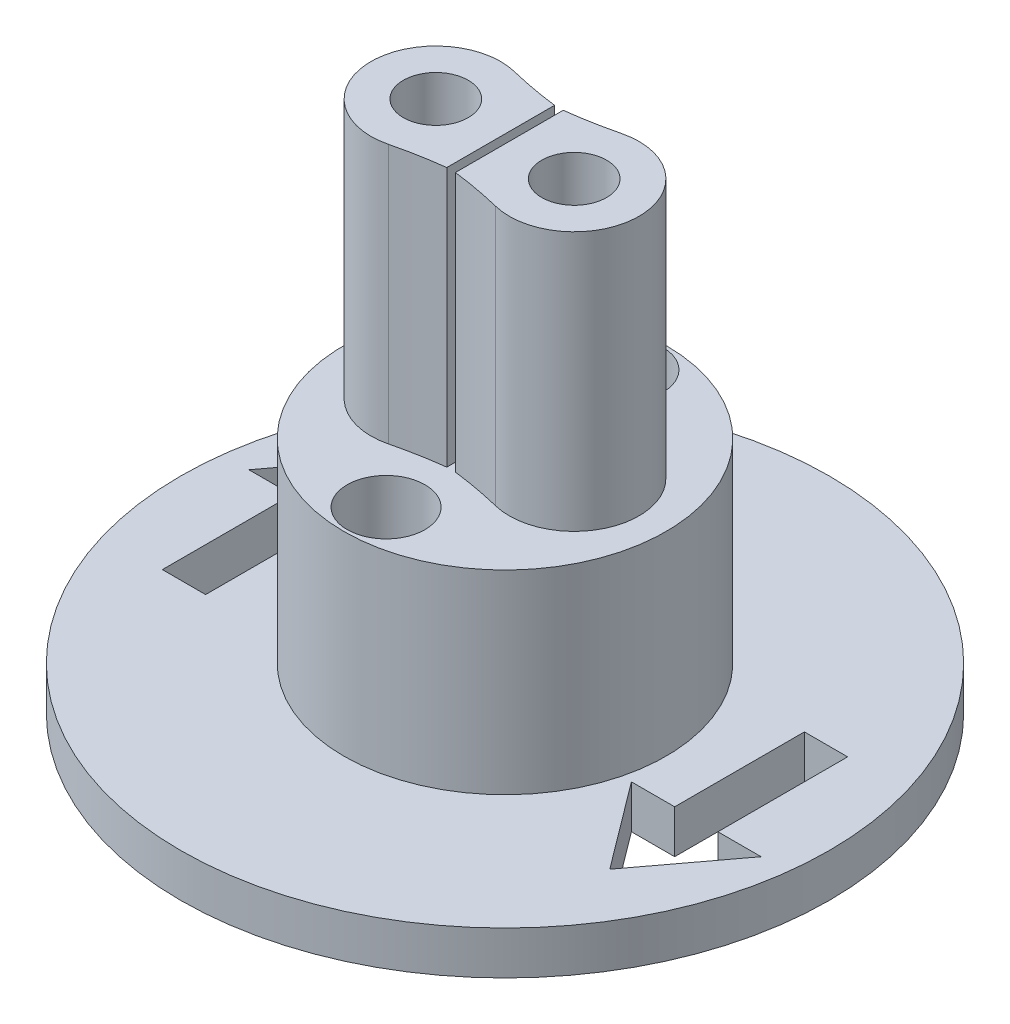
ISO-10303-21;
HEADER;
FILE_DESCRIPTION(('STEP AP214'),'2;1');
FILE_NAME('part.step','',(''),(''),'','','');
FILE_SCHEMA(('AUTOMOTIVE_DESIGN { 1 0 10303 214 1 1 1 1 }'));
ENDSEC;
DATA;
#1=APPLICATION_CONTEXT('core data for automotive mechanical design processes');
#2=APPLICATION_PROTOCOL_DEFINITION('international standard','automotive_design',2000,#1);
#3=PRODUCT_CONTEXT('',#1,'mechanical');
#4=PRODUCT('Part','Part','',(#3));
#5=PRODUCT_RELATED_PRODUCT_CATEGORY('part','',(#4));
#6=PRODUCT_DEFINITION_FORMATION('','',#4);
#7=PRODUCT_DEFINITION_CONTEXT('part definition',#1,'design');
#8=PRODUCT_DEFINITION('design','',#6,#7);
#9=PRODUCT_DEFINITION_SHAPE('','',#8);
#10=(LENGTH_UNIT() NAMED_UNIT(*) SI_UNIT(.MILLI.,.METRE.));
#11=(NAMED_UNIT(*) PLANE_ANGLE_UNIT() SI_UNIT($,.RADIAN.));
#12=(NAMED_UNIT(*) SI_UNIT($,.STERADIAN.) SOLID_ANGLE_UNIT());
#13=UNCERTAINTY_MEASURE_WITH_UNIT(LENGTH_MEASURE(1.E-05),#10,'distance_accuracy_value','');
#14=(GEOMETRIC_REPRESENTATION_CONTEXT(3) GLOBAL_UNCERTAINTY_ASSIGNED_CONTEXT((#13)) GLOBAL_UNIT_ASSIGNED_CONTEXT((#10,
#11,#12)) REPRESENTATION_CONTEXT('',''));
#15=CARTESIAN_POINT('',(0.,0.,0.));
#16=DIRECTION('',(0.,0.,1.));
#17=DIRECTION('',(1.,0.,0.));
#18=AXIS2_PLACEMENT_3D('',#15,#16,#17);
#19=CARTESIAN_POINT('',(0.,13.97,0.));
#20=DIRECTION('',(0.,1.,0.));
#21=DIRECTION('',(0.,0.,1.));
#22=AXIS2_PLACEMENT_3D('',#19,#20,#21);
#23=PLANE('',#22);
#24=CARTESIAN_POINT('',(0.,13.97,6.985));
#25=DIRECTION('',(0.,1.,0.));
#26=DIRECTION('',(0.,0.,1.));
#27=AXIS2_PLACEMENT_3D('',#24,#25,#26);
#28=CIRCLE('',#27,2.286);
#29=CARTESIAN_POINT('',(0.,13.97,9.271));
#30=VERTEX_POINT('',#29);
#31=EDGE_CURVE('E321',#30,#30,#28,.T.);
#32=ORIENTED_EDGE('',*,*,#31,.F.);
#33=EDGE_LOOP('',(#32));
#34=FACE_BOUND('',#33,.T.);
#35=CARTESIAN_POINT('',(0.,13.97,-6.985));
#36=DIRECTION('',(0.,1.,0.));
#37=DIRECTION('',(0.,0.,1.));
#38=AXIS2_PLACEMENT_3D('',#35,#36,#37);
#39=CIRCLE('',#38,2.286);
#40=CARTESIAN_POINT('',(0.,13.97,-4.699));
#41=VERTEX_POINT('',#40);
#42=EDGE_CURVE('E314',#41,#41,#39,.T.);
#43=ORIENTED_EDGE('',*,*,#42,.F.);
#44=EDGE_LOOP('',(#43));
#45=FACE_BOUND('',#44,.T.);
#46=DIRECTION('',(0.,0.,1.));
#47=VECTOR('',#46,1.);
#48=CARTESIAN_POINT('',(0.253999999999998,13.97,0.));
#49=LINE('',#48,#47);
#50=CARTESIAN_POINT('',(0.253999999999998,13.97,-3.16482369177179));
#51=VERTEX_POINT('',#50);
#52=CARTESIAN_POINT('',(0.253999999999998,13.97,3.16482369177179));
#53=VERTEX_POINT('',#52);
#54=EDGE_CURVE('E331',#51,#53,#49,.T.);
#55=ORIENTED_EDGE('',*,*,#54,.F.);
#56=CARTESIAN_POINT('',(-2.89555706157027,13.97,-28.3687973926768));
#57=DIRECTION('',(0.,1.,0.));
#58=DIRECTION('',(0.,0.,1.));
#59=AXIS2_PLACEMENT_3D('',#56,#57,#58);
#60=CIRCLE('',#59,25.4);
#61=CARTESIAN_POINT('',(3.15623168762127,13.97,-3.70027792078393));
#62=VERTEX_POINT('',#61);
#63=EDGE_CURVE('E401',#51,#62,#60,.T.);
#64=ORIENTED_EDGE('',*,*,#63,.T.);
#65=CARTESIAN_POINT('',(4.064,13.97,0.));
#66=DIRECTION('',(0.,1.,0.));
#67=DIRECTION('',(0.,0.,1.));
#68=AXIS2_PLACEMENT_3D('',#65,#66,#67);
#69=CIRCLE('',#68,3.81);
#70=CARTESIAN_POINT('',(3.15623168762127,13.97,3.70027792078393));
#71=VERTEX_POINT('',#70);
#72=EDGE_CURVE('E325',#71,#62,#69,.T.);
#73=ORIENTED_EDGE('',*,*,#72,.F.);
#74=CARTESIAN_POINT('',(-2.89555706157026,13.97,28.3687973926768));
#75=DIRECTION('',(0.,1.,0.));
#76=DIRECTION('',(0.,0.,1.));
#77=AXIS2_PLACEMENT_3D('',#74,#75,#76);
#78=CIRCLE('',#77,25.4);
#79=EDGE_CURVE('E395',#71,#53,#78,.T.);
#80=ORIENTED_EDGE('',*,*,#79,.T.);
#81=EDGE_LOOP('',(#55,#64,#73,#80));
#82=FACE_BOUND('',#81,.T.);
#83=CARTESIAN_POINT('',(0.,13.97,0.));
#84=DIRECTION('',(0.,1.,0.));
#85=DIRECTION('',(0.,0.,1.));
#86=AXIS2_PLACEMENT_3D('',#83,#84,#85);
#87=CIRCLE('',#86,9.46150000000001);
#88=CARTESIAN_POINT('',(0.,13.97,9.46150000000001));
#89=VERTEX_POINT('',#88);
#90=EDGE_CURVE('E385',#89,#89,#87,.T.);
#91=ORIENTED_EDGE('',*,*,#90,.T.);
#92=EDGE_LOOP('',(#91));
#93=FACE_BOUND('',#92,.T.);
#94=CARTESIAN_POINT('',(-4.064,13.97,0.));
#95=DIRECTION('',(0.,1.,0.));
#96=DIRECTION('',(0.,0.,1.));
#97=AXIS2_PLACEMENT_3D('',#94,#95,#96);
#98=CIRCLE('',#97,3.81);
#99=CARTESIAN_POINT('',(-3.15623168762127,13.97,-3.70027792078393));
#100=VERTEX_POINT('',#99);
#101=CARTESIAN_POINT('',(-3.15623168762127,13.97,3.70027792078393));
#102=VERTEX_POINT('',#101);
#103=EDGE_CURVE('E358',#100,#102,#98,.T.);
#104=ORIENTED_EDGE('',*,*,#103,.F.);
#105=CARTESIAN_POINT('',(2.89555706157026,13.97,-28.3687973926768));
#106=DIRECTION('',(0.,1.,0.));
#107=DIRECTION('',(0.,0.,1.));
#108=AXIS2_PLACEMENT_3D('',#105,#106,#107);
#109=CIRCLE('',#108,25.4);
#110=CARTESIAN_POINT('',(-0.253999999999998,13.97,-3.16482369177179));
#111=VERTEX_POINT('',#110);
#112=EDGE_CURVE('E398',#100,#111,#109,.T.);
#113=ORIENTED_EDGE('',*,*,#112,.T.);
#114=DIRECTION('',(0.,0.,1.));
#115=VECTOR('',#114,1.);
#116=CARTESIAN_POINT('',(-0.253999999999998,13.97,0.));
#117=LINE('',#116,#115);
#118=CARTESIAN_POINT('',(-0.253999999999998,13.97,3.16482369177179));
#119=VERTEX_POINT('',#118);
#120=EDGE_CURVE('E352',#111,#119,#117,.T.);
#121=ORIENTED_EDGE('',*,*,#120,.T.);
#122=CARTESIAN_POINT('',(2.89555706157027,13.97,28.3687973926768));
#123=DIRECTION('',(0.,1.,0.));
#124=DIRECTION('',(0.,0.,1.));
#125=AXIS2_PLACEMENT_3D('',#122,#123,#124);
#126=CIRCLE('',#125,25.4);
#127=EDGE_CURVE('E392',#119,#102,#126,.T.);
#128=ORIENTED_EDGE('',*,*,#127,.T.);
#129=EDGE_LOOP('',(#104,#113,#121,#128));
#130=FACE_BOUND('',#129,.T.);
#131=ADVANCED_FACE('F46',(#34,#45,#82,#93,#130),#23,.T.);
#132=CARTESIAN_POINT('',(0.,13.97,0.));
#133=DIRECTION('',(0.,-1.,0.));
#134=DIRECTION('',(0.,0.,-1.));
#135=AXIS2_PLACEMENT_3D('',#132,#133,#134);
#136=CYLINDRICAL_SURFACE('',#135,9.46150000000001);
#137=CARTESIAN_POINT('',(0.,2.54,0.));
#138=DIRECTION('',(0.,1.,0.));
#139=DIRECTION('',(0.,0.,1.));
#140=AXIS2_PLACEMENT_3D('',#137,#138,#139);
#141=CIRCLE('',#140,9.46150000000001);
#142=CARTESIAN_POINT('',(0.,2.54,9.46150000000001));
#143=VERTEX_POINT('',#142);
#144=EDGE_CURVE('E302',#143,#143,#141,.F.);
#145=ORIENTED_EDGE('',*,*,#144,.F.);
#146=EDGE_LOOP('',(#145));
#147=FACE_BOUND('',#146,.T.);
#148=ORIENTED_EDGE('',*,*,#90,.F.);
#149=EDGE_LOOP('',(#148));
#150=FACE_BOUND('',#149,.T.);
#151=ADVANCED_FACE('F508',(#147,#150),#136,.T.);
#152=CARTESIAN_POINT('',(0.,0.,0.));
#153=DIRECTION('',(0.,1.,0.));
#154=DIRECTION('',(0.,0.,1.));
#155=AXIS2_PLACEMENT_3D('',#152,#153,#154);
#156=PLANE('',#155);
#157=DIRECTION('',(0.,0.,-1.));
#158=VECTOR('',#157,1.);
#159=CARTESIAN_POINT('',(-14.8242240281211,0.,0.));
#160=LINE('',#159,#158);
#161=CARTESIAN_POINT('',(-14.8242240281211,0.,5.30038218060918));
#162=VERTEX_POINT('',#161);
#163=CARTESIAN_POINT('',(-14.8242240281211,0.,-2.31961781939082));
#164=VERTEX_POINT('',#163);
#165=EDGE_CURVE('E208',#162,#164,#160,.T.);
#166=ORIENTED_EDGE('',*,*,#165,.F.);
#167=DIRECTION('',(-1.,0.,0.));
#168=VECTOR('',#167,1.);
#169=CARTESIAN_POINT('',(0.,0.,5.30038218060919));
#170=LINE('',#169,#168);
#171=CARTESIAN_POINT('',(-12.2842240281211,0.,5.30038218060918));
#172=VERTEX_POINT('',#171);
#173=EDGE_CURVE('E62',#172,#162,#170,.T.);
#174=ORIENTED_EDGE('',*,*,#173,.F.);
#175=DIRECTION('',(0.,0.,-1.));
#176=VECTOR('',#175,1.);
#177=CARTESIAN_POINT('',(-12.2842240281211,0.,0.));
#178=LINE('',#177,#176);
#179=CARTESIAN_POINT('',(-12.2842240281211,0.,-2.31961781939082));
#180=VERTEX_POINT('',#179);
#181=EDGE_CURVE('E226',#172,#180,#178,.T.);
#182=ORIENTED_EDGE('',*,*,#181,.T.);
#183=DIRECTION('',(1.,0.,0.));
#184=VECTOR('',#183,1.);
#185=CARTESIAN_POINT('',(0.,0.,-2.31961781939081));
#186=LINE('',#185,#184);
#187=CARTESIAN_POINT('',(-9.74422402812105,0.,-2.31961781939082));
#188=VERTEX_POINT('',#187);
#189=EDGE_CURVE('E220',#180,#188,#186,.T.);
#190=ORIENTED_EDGE('',*,*,#189,.T.);
#191=DIRECTION('',(-0.6,0.,-0.8));
#192=VECTOR('',#191,1.);
#193=CARTESIAN_POINT('',(-5.12288682468988,0.,3.84216511851741));
#194=LINE('',#193,#192);
#195=CARTESIAN_POINT('',(-13.554224028121,0.,-7.39961781939082));
#196=VERTEX_POINT('',#195);
#197=EDGE_CURVE('E222',#188,#196,#194,.T.);
#198=ORIENTED_EDGE('',*,*,#197,.T.);
#199=DIRECTION('',(-0.6,0.,0.8));
#200=VECTOR('',#199,1.);
#201=CARTESIAN_POINT('',(-12.2265199313051,0.,-9.1698899484788));
#202=LINE('',#201,#200);
#203=CARTESIAN_POINT('',(-17.3642240281211,0.,-2.31961781939082));
#204=VERTEX_POINT('',#203);
#205=EDGE_CURVE('E217',#196,#204,#202,.T.);
#206=ORIENTED_EDGE('',*,*,#205,.T.);
#207=EDGE_CURVE('E198',#204,#164,#186,.T.);
#208=ORIENTED_EDGE('',*,*,#207,.T.);
#209=EDGE_LOOP('',(#166,#174,#182,#190,#198,#206,#208));
#210=FACE_BOUND('',#209,.T.);
#211=DIRECTION('',(0.,0.,1.));
#212=VECTOR('',#211,1.);
#213=CARTESIAN_POINT('',(14.8242240281211,0.,0.));
#214=LINE('',#213,#212);
#215=CARTESIAN_POINT('',(14.8242240281211,0.,-5.30038218060918));
#216=VERTEX_POINT('',#215);
#217=CARTESIAN_POINT('',(14.8242240281211,0.,2.31961781939082));
#218=VERTEX_POINT('',#217);
#219=EDGE_CURVE('E254',#216,#218,#214,.T.);
#220=ORIENTED_EDGE('',*,*,#219,.F.);
#221=DIRECTION('',(1.,0.,0.));
#222=VECTOR('',#221,1.);
#223=CARTESIAN_POINT('',(0.,0.,-5.30038218060919));
#224=LINE('',#223,#222);
#225=CARTESIAN_POINT('',(12.2842240281211,0.,-5.30038218060918));
#226=VERTEX_POINT('',#225);
#227=EDGE_CURVE('E238',#226,#216,#224,.T.);
#228=ORIENTED_EDGE('',*,*,#227,.F.);
#229=DIRECTION('',(0.,0.,1.));
#230=VECTOR('',#229,1.);
#231=CARTESIAN_POINT('',(12.2842240281211,0.,0.));
#232=LINE('',#231,#230);
#233=CARTESIAN_POINT('',(12.2842240281211,0.,2.31961781939082));
#234=VERTEX_POINT('',#233);
#235=EDGE_CURVE('E271',#226,#234,#232,.T.);
#236=ORIENTED_EDGE('',*,*,#235,.T.);
#237=DIRECTION('',(-1.,0.,0.));
#238=VECTOR('',#237,1.);
#239=CARTESIAN_POINT('',(0.,0.,2.31961781939081));
#240=LINE('',#239,#238);
#241=CARTESIAN_POINT('',(9.74422402812105,0.,2.31961781939082));
#242=VERTEX_POINT('',#241);
#243=EDGE_CURVE('E263',#234,#242,#240,.T.);
#244=ORIENTED_EDGE('',*,*,#243,.T.);
#245=DIRECTION('',(0.6,0.,0.8));
#246=VECTOR('',#245,1.);
#247=CARTESIAN_POINT('',(5.12288682468988,0.,-3.84216511851741));
#248=LINE('',#247,#246);
#249=CARTESIAN_POINT('',(13.554224028121,0.,7.39961781939082));
#250=VERTEX_POINT('',#249);
#251=EDGE_CURVE('E267',#242,#250,#248,.T.);
#252=ORIENTED_EDGE('',*,*,#251,.T.);
#253=DIRECTION('',(0.6,0.,-0.8));
#254=VECTOR('',#253,1.);
#255=CARTESIAN_POINT('',(12.2265199313051,0.,9.1698899484788));
#256=LINE('',#255,#254);
#257=CARTESIAN_POINT('',(17.3642240281211,0.,2.31961781939082));
#258=VERTEX_POINT('',#257);
#259=EDGE_CURVE('E262',#250,#258,#256,.T.);
#260=ORIENTED_EDGE('',*,*,#259,.T.);
#261=EDGE_CURVE('E258',#258,#218,#240,.T.);
#262=ORIENTED_EDGE('',*,*,#261,.T.);
#263=EDGE_LOOP('',(#220,#228,#236,#244,#252,#260,#262));
#264=FACE_BOUND('',#263,.T.);
#265=CARTESIAN_POINT('',(0.,0.,6.985));
#266=DIRECTION('',(0.,-1.,0.));
#267=DIRECTION('',(0.,0.,-1.));
#268=AXIS2_PLACEMENT_3D('',#265,#266,#267);
#269=CIRCLE('',#268,2.286);
#270=CARTESIAN_POINT('',(0.,0.,4.699));
#271=VERTEX_POINT('',#270);
#272=EDGE_CURVE('E310',#271,#271,#269,.T.);
#273=ORIENTED_EDGE('',*,*,#272,.F.);
#274=EDGE_LOOP('',(#273));
#275=FACE_BOUND('',#274,.T.);
#276=CARTESIAN_POINT('',(0.,0.,-6.985));
#277=DIRECTION('',(0.,-1.,0.));
#278=DIRECTION('',(0.,0.,1.));
#279=AXIS2_PLACEMENT_3D('',#276,#277,#278);
#280=CIRCLE('',#279,2.286);
#281=CARTESIAN_POINT('',(0.,0.,-4.699));
#282=VERTEX_POINT('',#281);
#283=EDGE_CURVE('E306',#282,#282,#280,.T.);
#284=ORIENTED_EDGE('',*,*,#283,.F.);
#285=EDGE_LOOP('',(#284));
#286=FACE_BOUND('',#285,.T.);
#287=CARTESIAN_POINT('',(-4.064,0.,0.));
#288=DIRECTION('',(0.,1.,0.));
#289=DIRECTION('',(0.,0.,1.));
#290=AXIS2_PLACEMENT_3D('',#287,#288,#289);
#291=CIRCLE('',#290,1.905);
#292=CARTESIAN_POINT('',(-4.064,0.,1.905));
#293=VERTEX_POINT('',#292);
#294=EDGE_CURVE('E381',#293,#293,#291,.T.);
#295=ORIENTED_EDGE('',*,*,#294,.T.);
#296=EDGE_LOOP('',(#295));
#297=FACE_BOUND('',#296,.T.);
#298=CARTESIAN_POINT('',(4.064,0.,0.));
#299=DIRECTION('',(0.,1.,0.));
#300=DIRECTION('',(0.,0.,1.));
#301=AXIS2_PLACEMENT_3D('',#298,#299,#300);
#302=CIRCLE('',#301,1.905);
#303=CARTESIAN_POINT('',(4.064,0.,1.905));
#304=VERTEX_POINT('',#303);
#305=EDGE_CURVE('E380',#304,#304,#302,.T.);
#306=ORIENTED_EDGE('',*,*,#305,.T.);
#307=EDGE_LOOP('',(#306));
#308=FACE_BOUND('',#307,.T.);
#309=CARTESIAN_POINT('',(0.,0.,0.));
#310=DIRECTION('',(0.,-1.,0.));
#311=DIRECTION('',(0.,0.,-1.));
#312=AXIS2_PLACEMENT_3D('',#309,#310,#311);
#313=CIRCLE('',#312,19.05);
#314=CARTESIAN_POINT('',(0.,0.,-19.05));
#315=VERTEX_POINT('',#314);
#316=EDGE_CURVE('E298',#315,#315,#313,.T.);
#317=ORIENTED_EDGE('',*,*,#316,.T.);
#318=EDGE_LOOP('',(#317));
#319=FACE_BOUND('',#318,.T.);
#320=ADVANCED_FACE('F213',(#210,#264,#275,#286,#297,#308,#319),#156,.F.);
#321=CARTESIAN_POINT('',(4.064,0.,0.));
#322=DIRECTION('',(0.,1.,0.));
#323=DIRECTION('',(0.,0.,1.));
#324=AXIS2_PLACEMENT_3D('',#321,#322,#323);
#325=CYLINDRICAL_SURFACE('',#324,1.905);
#326=ORIENTED_EDGE('',*,*,#305,.F.);
#327=EDGE_LOOP('',(#326));
#328=FACE_BOUND('',#327,.T.);
#329=CARTESIAN_POINT('',(4.064,29.21,0.));
#330=DIRECTION('',(0.,1.,0.));
#331=DIRECTION('',(0.,0.,1.));
#332=AXIS2_PLACEMENT_3D('',#329,#330,#331);
#333=CIRCLE('',#332,1.905);
#334=CARTESIAN_POINT('',(4.064,29.21,1.905));
#335=VERTEX_POINT('',#334);
#336=EDGE_CURVE('E326',#335,#335,#333,.F.);
#337=ORIENTED_EDGE('',*,*,#336,.F.);
#338=EDGE_LOOP('',(#337));
#339=FACE_BOUND('',#338,.T.);
#340=ADVANCED_FACE('F520',(#328,#339),#325,.F.);
#341=CARTESIAN_POINT('',(-4.064,0.,0.));
#342=DIRECTION('',(0.,1.,0.));
#343=DIRECTION('',(0.,0.,1.));
#344=AXIS2_PLACEMENT_3D('',#341,#342,#343);
#345=CYLINDRICAL_SURFACE('',#344,1.905);
#346=ORIENTED_EDGE('',*,*,#294,.F.);
#347=EDGE_LOOP('',(#346));
#348=FACE_BOUND('',#347,.T.);
#349=CARTESIAN_POINT('',(-4.064,29.21,0.));
#350=DIRECTION('',(0.,1.,0.));
#351=DIRECTION('',(0.,0.,1.));
#352=AXIS2_PLACEMENT_3D('',#349,#350,#351);
#353=CIRCLE('',#352,1.905);
#354=CARTESIAN_POINT('',(-4.064,29.21,1.905));
#355=VERTEX_POINT('',#354);
#356=EDGE_CURVE('E353',#355,#355,#353,.F.);
#357=ORIENTED_EDGE('',*,*,#356,.F.);
#358=EDGE_LOOP('',(#357));
#359=FACE_BOUND('',#358,.T.);
#360=ADVANCED_FACE('F575',(#348,#359),#345,.F.);
#361=CARTESIAN_POINT('',(-0.253999999999998,29.21,0.));
#362=DIRECTION('',(1.,0.,0.));
#363=DIRECTION('',(0.,0.,-1.));
#364=AXIS2_PLACEMENT_3D('',#361,#362,#363);
#365=PLANE('',#364);
#366=ORIENTED_EDGE('',*,*,#120,.F.);
#367=DIRECTION('',(0.,-1.,0.));
#368=VECTOR('',#367,1.);
#369=CARTESIAN_POINT('',(-0.253999999999998,29.21,-3.16482369177179));
#370=LINE('',#369,#368);
#371=CARTESIAN_POINT('',(-0.253999999999998,29.21,-3.16482369177179));
#372=VERTEX_POINT('',#371);
#373=EDGE_CURVE('E376',#372,#111,#370,.T.);
#374=ORIENTED_EDGE('',*,*,#373,.F.);
#375=DIRECTION('',(0.,0.,1.));
#376=VECTOR('',#375,1.);
#377=CARTESIAN_POINT('',(-0.253999999999998,29.21,0.));
#378=LINE('',#377,#376);
#379=CARTESIAN_POINT('',(-0.253999999999998,29.21,3.16482369177179));
#380=VERTEX_POINT('',#379);
#381=EDGE_CURVE('E357',#372,#380,#378,.T.);
#382=ORIENTED_EDGE('',*,*,#381,.T.);
#383=DIRECTION('',(0.,-1.,0.));
#384=VECTOR('',#383,1.);
#385=CARTESIAN_POINT('',(-0.253999999999998,29.21,3.16482369177179));
#386=LINE('',#385,#384);
#387=EDGE_CURVE('E366',#380,#119,#386,.T.);
#388=ORIENTED_EDGE('',*,*,#387,.T.);
#389=EDGE_LOOP('',(#366,#374,#382,#388));
#390=FACE_BOUND('',#389,.T.);
#391=ADVANCED_FACE('F573',(#390),#365,.T.);
#392=CARTESIAN_POINT('',(-4.064,29.21,0.));
#393=DIRECTION('',(0.,-1.,0.));
#394=DIRECTION('',(0.,0.,-1.));
#395=AXIS2_PLACEMENT_3D('',#392,#393,#394);
#396=CYLINDRICAL_SURFACE('',#395,3.81);
#397=CARTESIAN_POINT('',(-4.064,29.21,0.));
#398=DIRECTION('',(0.,1.,0.));
#399=DIRECTION('',(0.,0.,1.));
#400=AXIS2_PLACEMENT_3D('',#397,#398,#399);
#401=CIRCLE('',#400,3.81);
#402=CARTESIAN_POINT('',(-3.15623168762127,29.21,-3.70027792078393));
#403=VERTEX_POINT('',#402);
#404=CARTESIAN_POINT('',(-3.15623168762127,29.21,3.70027792078393));
#405=VERTEX_POINT('',#404);
#406=EDGE_CURVE('E362',#403,#405,#401,.T.);
#407=ORIENTED_EDGE('',*,*,#406,.F.);
#408=DIRECTION('',(0.,-1.,0.));
#409=VECTOR('',#408,1.);
#410=CARTESIAN_POINT('',(-3.15623168762127,29.21,-3.70027792078393));
#411=LINE('',#410,#409);
#412=EDGE_CURVE('E414',#403,#100,#411,.T.);
#413=ORIENTED_EDGE('',*,*,#412,.T.);
#414=ORIENTED_EDGE('',*,*,#103,.T.);
#415=DIRECTION('',(0.,-1.,0.));
#416=VECTOR('',#415,1.);
#417=CARTESIAN_POINT('',(-3.15623168762127,29.21,3.70027792078393));
#418=LINE('',#417,#416);
#419=EDGE_CURVE('E411',#102,#405,#418,.F.);
#420=ORIENTED_EDGE('',*,*,#419,.T.);
#421=EDGE_LOOP('',(#407,#413,#414,#420));
#422=FACE_BOUND('',#421,.T.);
#423=ADVANCED_FACE('F564',(#422),#396,.T.);
#424=CARTESIAN_POINT('',(0.,29.21,0.));
#425=DIRECTION('',(0.,1.,0.));
#426=DIRECTION('',(0.,0.,1.));
#427=AXIS2_PLACEMENT_3D('',#424,#425,#426);
#428=PLANE('',#427);
#429=ORIENTED_EDGE('',*,*,#356,.T.);
#430=EDGE_LOOP('',(#429));
#431=FACE_BOUND('',#430,.T.);
#432=ORIENTED_EDGE('',*,*,#381,.F.);
#433=CARTESIAN_POINT('',(2.89555706157026,29.21,-28.3687973926768));
#434=DIRECTION('',(0.,1.,0.));
#435=DIRECTION('',(0.,0.,1.));
#436=AXIS2_PLACEMENT_3D('',#433,#434,#435);
#437=CIRCLE('',#436,25.4);
#438=EDGE_CURVE('E421',#372,#403,#437,.F.);
#439=ORIENTED_EDGE('',*,*,#438,.T.);
#440=ORIENTED_EDGE('',*,*,#406,.T.);
#441=CARTESIAN_POINT('',(2.89555706157027,29.21,28.3687973926768));
#442=DIRECTION('',(0.,1.,0.));
#443=DIRECTION('',(0.,0.,1.));
#444=AXIS2_PLACEMENT_3D('',#441,#442,#443);
#445=CIRCLE('',#444,25.4);
#446=EDGE_CURVE('E427',#405,#380,#445,.F.);
#447=ORIENTED_EDGE('',*,*,#446,.T.);
#448=EDGE_LOOP('',(#432,#439,#440,#447));
#449=FACE_BOUND('',#448,.T.);
#450=ADVANCED_FACE('F570',(#431,#449),#428,.T.);
#451=CARTESIAN_POINT('',(4.064,29.21,0.));
#452=DIRECTION('',(0.,-1.,0.));
#453=DIRECTION('',(0.,0.,-1.));
#454=AXIS2_PLACEMENT_3D('',#451,#452,#453);
#455=CYLINDRICAL_SURFACE('',#454,3.81);
#456=ORIENTED_EDGE('',*,*,#72,.T.);
#457=DIRECTION('',(0.,-1.,0.));
#458=VECTOR('',#457,1.);
#459=CARTESIAN_POINT('',(3.15623168762127,29.21,-3.70027792078393));
#460=LINE('',#459,#458);
#461=CARTESIAN_POINT('',(3.15623168762127,29.21,-3.70027792078393));
#462=VERTEX_POINT('',#461);
#463=EDGE_CURVE('E408',#62,#462,#460,.F.);
#464=ORIENTED_EDGE('',*,*,#463,.T.);
#465=CARTESIAN_POINT('',(4.064,29.21,0.));
#466=DIRECTION('',(0.,1.,0.));
#467=DIRECTION('',(0.,0.,1.));
#468=AXIS2_PLACEMENT_3D('',#465,#466,#467);
#469=CIRCLE('',#468,3.81);
#470=CARTESIAN_POINT('',(3.15623168762127,29.21,3.70027792078393));
#471=VERTEX_POINT('',#470);
#472=EDGE_CURVE('E330',#471,#462,#469,.T.);
#473=ORIENTED_EDGE('',*,*,#472,.F.);
#474=DIRECTION('',(0.,-1.,0.));
#475=VECTOR('',#474,1.);
#476=CARTESIAN_POINT('',(3.15623168762127,29.21,3.70027792078393));
#477=LINE('',#476,#475);
#478=EDGE_CURVE('E404',#471,#71,#477,.T.);
#479=ORIENTED_EDGE('',*,*,#478,.T.);
#480=EDGE_LOOP('',(#456,#464,#473,#479));
#481=FACE_BOUND('',#480,.T.);
#482=ADVANCED_FACE('F548',(#481),#455,.T.);
#483=CARTESIAN_POINT('',(0.253999999999998,29.21,0.));
#484=DIRECTION('',(1.,0.,0.));
#485=DIRECTION('',(0.,0.,-1.));
#486=AXIS2_PLACEMENT_3D('',#483,#484,#485);
#487=PLANE('',#486);
#488=ORIENTED_EDGE('',*,*,#54,.T.);
#489=DIRECTION('',(0.,-1.,0.));
#490=VECTOR('',#489,1.);
#491=CARTESIAN_POINT('',(0.253999999999998,29.21,3.16482369177179));
#492=LINE('',#491,#490);
#493=CARTESIAN_POINT('',(0.253999999999998,29.21,3.16482369177179));
#494=VERTEX_POINT('',#493);
#495=EDGE_CURVE('E338',#494,#53,#492,.T.);
#496=ORIENTED_EDGE('',*,*,#495,.F.);
#497=DIRECTION('',(0.,0.,1.));
#498=VECTOR('',#497,1.);
#499=CARTESIAN_POINT('',(0.253999999999998,29.21,0.));
#500=LINE('',#499,#498);
#501=CARTESIAN_POINT('',(0.253999999999998,29.21,-3.16482369177179));
#502=VERTEX_POINT('',#501);
#503=EDGE_CURVE('E335',#502,#494,#500,.T.);
#504=ORIENTED_EDGE('',*,*,#503,.F.);
#505=DIRECTION('',(0.,-1.,0.));
#506=VECTOR('',#505,1.);
#507=CARTESIAN_POINT('',(0.253999999999998,29.21,-3.16482369177179));
#508=LINE('',#507,#506);
#509=EDGE_CURVE('E348',#502,#51,#508,.T.);
#510=ORIENTED_EDGE('',*,*,#509,.T.);
#511=EDGE_LOOP('',(#488,#496,#504,#510));
#512=FACE_BOUND('',#511,.T.);
#513=ADVANCED_FACE('F553',(#512),#487,.F.);
#514=CARTESIAN_POINT('',(0.,29.21,0.));
#515=DIRECTION('',(0.,1.,0.));
#516=DIRECTION('',(0.,0.,1.));
#517=AXIS2_PLACEMENT_3D('',#514,#515,#516);
#518=PLANE('',#517);
#519=ORIENTED_EDGE('',*,*,#336,.T.);
#520=EDGE_LOOP('',(#519));
#521=FACE_BOUND('',#520,.T.);
#522=ORIENTED_EDGE('',*,*,#503,.T.);
#523=CARTESIAN_POINT('',(-2.89555706157026,29.21,28.3687973926768));
#524=DIRECTION('',(0.,1.,0.));
#525=DIRECTION('',(0.,0.,1.));
#526=AXIS2_PLACEMENT_3D('',#523,#524,#525);
#527=CIRCLE('',#526,25.4);
#528=EDGE_CURVE('E424',#494,#471,#527,.F.);
#529=ORIENTED_EDGE('',*,*,#528,.T.);
#530=ORIENTED_EDGE('',*,*,#472,.T.);
#531=CARTESIAN_POINT('',(-2.89555706157027,29.21,-28.3687973926768));
#532=DIRECTION('',(0.,1.,0.));
#533=DIRECTION('',(0.,0.,1.));
#534=AXIS2_PLACEMENT_3D('',#531,#532,#533);
#535=CIRCLE('',#534,25.4);
#536=EDGE_CURVE('E418',#462,#502,#535,.F.);
#537=ORIENTED_EDGE('',*,*,#536,.T.);
#538=EDGE_LOOP('',(#522,#529,#530,#537));
#539=FACE_BOUND('',#538,.T.);
#540=ADVANCED_FACE('F528',(#521,#539),#518,.T.);
#541=CARTESIAN_POINT('',(-2.89555706157027,29.21,-28.3687973926768));
#542=DIRECTION('',(0.,1.,0.));
#543=DIRECTION('',(0.,0.,1.));
#544=AXIS2_PLACEMENT_3D('',#541,#542,#543);
#545=CYLINDRICAL_SURFACE('',#544,25.4);
#546=ORIENTED_EDGE('',*,*,#536,.F.);
#547=ORIENTED_EDGE('',*,*,#463,.F.);
#548=ORIENTED_EDGE('',*,*,#63,.F.);
#549=ORIENTED_EDGE('',*,*,#509,.F.);
#550=EDGE_LOOP('',(#546,#547,#548,#549));
#551=FACE_BOUND('',#550,.T.);
#552=ADVANCED_FACE('F524',(#551),#545,.F.);
#553=CARTESIAN_POINT('',(2.89555706157026,29.21,-28.3687973926768));
#554=DIRECTION('',(0.,1.,0.));
#555=DIRECTION('',(0.,0.,1.));
#556=AXIS2_PLACEMENT_3D('',#553,#554,#555);
#557=CYLINDRICAL_SURFACE('',#556,25.4);
#558=ORIENTED_EDGE('',*,*,#438,.F.);
#559=ORIENTED_EDGE('',*,*,#373,.T.);
#560=ORIENTED_EDGE('',*,*,#112,.F.);
#561=ORIENTED_EDGE('',*,*,#412,.F.);
#562=EDGE_LOOP('',(#558,#559,#560,#561));
#563=FACE_BOUND('',#562,.T.);
#564=ADVANCED_FACE('F527',(#563),#557,.F.);
#565=CARTESIAN_POINT('',(-2.89555706157026,29.21,28.3687973926768));
#566=DIRECTION('',(0.,1.,0.));
#567=DIRECTION('',(0.,0.,1.));
#568=AXIS2_PLACEMENT_3D('',#565,#566,#567);
#569=CYLINDRICAL_SURFACE('',#568,25.4);
#570=ORIENTED_EDGE('',*,*,#528,.F.);
#571=ORIENTED_EDGE('',*,*,#495,.T.);
#572=ORIENTED_EDGE('',*,*,#79,.F.);
#573=ORIENTED_EDGE('',*,*,#478,.F.);
#574=EDGE_LOOP('',(#570,#571,#572,#573));
#575=FACE_BOUND('',#574,.T.);
#576=ADVANCED_FACE('F531',(#575),#569,.F.);
#577=CARTESIAN_POINT('',(2.89555706157027,29.21,28.3687973926768));
#578=DIRECTION('',(0.,1.,0.));
#579=DIRECTION('',(0.,0.,1.));
#580=AXIS2_PLACEMENT_3D('',#577,#578,#579);
#581=CYLINDRICAL_SURFACE('',#580,25.4);
#582=ORIENTED_EDGE('',*,*,#446,.F.);
#583=ORIENTED_EDGE('',*,*,#419,.F.);
#584=ORIENTED_EDGE('',*,*,#127,.F.);
#585=ORIENTED_EDGE('',*,*,#387,.F.);
#586=EDGE_LOOP('',(#582,#583,#584,#585));
#587=FACE_BOUND('',#586,.T.);
#588=ADVANCED_FACE('F48',(#587),#581,.F.);
#589=CARTESIAN_POINT('',(0.,29.21,-6.985));
#590=DIRECTION('',(0.,-1.,0.));
#591=DIRECTION('',(0.,0.,-1.));
#592=AXIS2_PLACEMENT_3D('',#589,#590,#591);
#593=CYLINDRICAL_SURFACE('',#592,2.286);
#594=ORIENTED_EDGE('',*,*,#42,.T.);
#595=EDGE_LOOP('',(#594));
#596=FACE_BOUND('',#595,.T.);
#597=ORIENTED_EDGE('',*,*,#283,.T.);
#598=EDGE_LOOP('',(#597));
#599=FACE_BOUND('',#598,.T.);
#600=ADVANCED_FACE('F538',(#596,#599),#593,.F.);
#601=CARTESIAN_POINT('',(0.,29.21,6.985));
#602=DIRECTION('',(0.,-1.,0.));
#603=DIRECTION('',(0.,0.,-1.));
#604=AXIS2_PLACEMENT_3D('',#601,#602,#603);
#605=CYLINDRICAL_SURFACE('',#604,2.286);
#606=ORIENTED_EDGE('',*,*,#31,.T.);
#607=EDGE_LOOP('',(#606));
#608=FACE_BOUND('',#607,.T.);
#609=ORIENTED_EDGE('',*,*,#272,.T.);
#610=EDGE_LOOP('',(#609));
#611=FACE_BOUND('',#610,.T.);
#612=ADVANCED_FACE('F596',(#608,#611),#605,.F.);
#613=CARTESIAN_POINT('',(0.,67.8515367264149,0.));
#614=DIRECTION('',(0.,-1.,0.));
#615=DIRECTION('',(0.,0.,-1.));
#616=AXIS2_PLACEMENT_3D('',#613,#614,#615);
#617=CYLINDRICAL_SURFACE('',#616,19.05);
#618=ORIENTED_EDGE('',*,*,#316,.F.);
#619=EDGE_LOOP('',(#618));
#620=FACE_BOUND('',#619,.T.);
#621=CARTESIAN_POINT('',(0.,2.54,0.));
#622=DIRECTION('',(0.,1.,0.));
#623=DIRECTION('',(0.,0.,1.));
#624=AXIS2_PLACEMENT_3D('',#621,#622,#623);
#625=CIRCLE('',#624,19.05);
#626=CARTESIAN_POINT('',(0.,2.54,19.05));
#627=VERTEX_POINT('',#626);
#628=EDGE_CURVE('E279',#627,#627,#625,.F.);
#629=ORIENTED_EDGE('',*,*,#628,.T.);
#630=EDGE_LOOP('',(#629));
#631=FACE_BOUND('',#630,.T.);
#632=ADVANCED_FACE('F600',(#620,#631),#617,.T.);
#633=CARTESIAN_POINT('',(0.,2.54,0.));
#634=DIRECTION('',(0.,1.,0.));
#635=DIRECTION('',(0.,0.,1.));
#636=AXIS2_PLACEMENT_3D('',#633,#634,#635);
#637=PLANE('',#636);
#638=DIRECTION('',(1.,0.,0.));
#639=VECTOR('',#638,1.);
#640=CARTESIAN_POINT('',(0.,2.54,5.30038218060919));
#641=LINE('',#640,#639);
#642=CARTESIAN_POINT('',(-14.8242240281211,2.54,5.30038218060918));
#643=VERTEX_POINT('',#642);
#644=CARTESIAN_POINT('',(-12.2842240281211,2.54,5.30038218060918));
#645=VERTEX_POINT('',#644);
#646=EDGE_CURVE('E12',#643,#645,#641,.T.);
#647=ORIENTED_EDGE('',*,*,#646,.F.);
#648=DIRECTION('',(0.,0.,1.));
#649=VECTOR('',#648,1.);
#650=CARTESIAN_POINT('',(-14.8242240281211,2.54,0.));
#651=LINE('',#650,#649);
#652=CARTESIAN_POINT('',(-14.8242240281211,2.54,-2.31961781939082));
#653=VERTEX_POINT('',#652);
#654=EDGE_CURVE('E456',#653,#643,#651,.T.);
#655=ORIENTED_EDGE('',*,*,#654,.F.);
#656=DIRECTION('',(-1.,0.,0.));
#657=VECTOR('',#656,1.);
#658=CARTESIAN_POINT('',(0.,2.54,-2.31961781939081));
#659=LINE('',#658,#657);
#660=CARTESIAN_POINT('',(-17.3642240281211,2.54,-2.31961781939082));
#661=VERTEX_POINT('',#660);
#662=EDGE_CURVE('E201',#653,#661,#659,.T.);
#663=ORIENTED_EDGE('',*,*,#662,.T.);
#664=DIRECTION('',(0.6,0.,-0.8));
#665=VECTOR('',#664,1.);
#666=CARTESIAN_POINT('',(-12.2265199313051,2.54,-9.1698899484788));
#667=LINE('',#666,#665);
#668=CARTESIAN_POINT('',(-13.554224028121,2.54,-7.39961781939082));
#669=VERTEX_POINT('',#668);
#670=EDGE_CURVE('E461',#661,#669,#667,.T.);
#671=ORIENTED_EDGE('',*,*,#670,.T.);
#672=DIRECTION('',(0.6,0.,0.8));
#673=VECTOR('',#672,1.);
#674=CARTESIAN_POINT('',(-5.12288682468988,2.54,3.84216511851741));
#675=LINE('',#674,#673);
#676=CARTESIAN_POINT('',(-9.74422402812105,2.54,-2.31961781939082));
#677=VERTEX_POINT('',#676);
#678=EDGE_CURVE('E465',#669,#677,#675,.T.);
#679=ORIENTED_EDGE('',*,*,#678,.T.);
#680=DIRECTION('',(-1.,0.,0.));
#681=VECTOR('',#680,1.);
#682=CARTESIAN_POINT('',(0.,2.54,-2.31961781939081));
#683=LINE('',#682,#681);
#684=CARTESIAN_POINT('',(-12.2842240281211,2.54,-2.31961781939082));
#685=VERTEX_POINT('',#684);
#686=EDGE_CURVE('E469',#677,#685,#683,.T.);
#687=ORIENTED_EDGE('',*,*,#686,.T.);
#688=DIRECTION('',(0.,0.,1.));
#689=VECTOR('',#688,1.);
#690=CARTESIAN_POINT('',(-12.2842240281211,2.54,0.));
#691=LINE('',#690,#689);
#692=EDGE_CURVE('E55',#685,#645,#691,.T.);
#693=ORIENTED_EDGE('',*,*,#692,.T.);
#694=EDGE_LOOP('',(#647,#655,#663,#671,#679,#687,#693));
#695=FACE_BOUND('',#694,.T.);
#696=DIRECTION('',(-1.,0.,0.));
#697=VECTOR('',#696,1.);
#698=CARTESIAN_POINT('',(0.,2.54,-5.30038218060919));
#699=LINE('',#698,#697);
#700=CARTESIAN_POINT('',(14.8242240281211,2.54,-5.30038218060918));
#701=VERTEX_POINT('',#700);
#702=CARTESIAN_POINT('',(12.2842240281211,2.54,-5.30038218060918));
#703=VERTEX_POINT('',#702);
#704=EDGE_CURVE('E453',#701,#703,#699,.T.);
#705=ORIENTED_EDGE('',*,*,#704,.F.);
#706=DIRECTION('',(0.,0.,-1.));
#707=VECTOR('',#706,1.);
#708=CARTESIAN_POINT('',(14.8242240281211,2.54,0.));
#709=LINE('',#708,#707);
#710=CARTESIAN_POINT('',(14.8242240281211,2.54,2.31961781939082));
#711=VERTEX_POINT('',#710);
#712=EDGE_CURVE('E430',#711,#701,#709,.T.);
#713=ORIENTED_EDGE('',*,*,#712,.F.);
#714=DIRECTION('',(1.,0.,0.));
#715=VECTOR('',#714,1.);
#716=CARTESIAN_POINT('',(0.,2.54,2.31961781939081));
#717=LINE('',#716,#715);
#718=CARTESIAN_POINT('',(17.3642240281211,2.54,2.31961781939082));
#719=VERTEX_POINT('',#718);
#720=EDGE_CURVE('E433',#711,#719,#717,.T.);
#721=ORIENTED_EDGE('',*,*,#720,.T.);
#722=DIRECTION('',(-0.6,0.,0.8));
#723=VECTOR('',#722,1.);
#724=CARTESIAN_POINT('',(12.2265199313051,2.54,9.1698899484788));
#725=LINE('',#724,#723);
#726=CARTESIAN_POINT('',(13.554224028121,2.54,7.39961781939082));
#727=VERTEX_POINT('',#726);
#728=EDGE_CURVE('E437',#719,#727,#725,.T.);
#729=ORIENTED_EDGE('',*,*,#728,.T.);
#730=DIRECTION('',(-0.6,0.,-0.8));
#731=VECTOR('',#730,1.);
#732=CARTESIAN_POINT('',(5.12288682468988,2.54,-3.84216511851741));
#733=LINE('',#732,#731);
#734=CARTESIAN_POINT('',(9.74422402812105,2.54,2.31961781939082));
#735=VERTEX_POINT('',#734);
#736=EDGE_CURVE('E441',#727,#735,#733,.T.);
#737=ORIENTED_EDGE('',*,*,#736,.T.);
#738=DIRECTION('',(1.,0.,0.));
#739=VECTOR('',#738,1.);
#740=CARTESIAN_POINT('',(0.,2.54,2.31961781939081));
#741=LINE('',#740,#739);
#742=CARTESIAN_POINT('',(12.2842240281211,2.54,2.31961781939082));
#743=VERTEX_POINT('',#742);
#744=EDGE_CURVE('E445',#735,#743,#741,.T.);
#745=ORIENTED_EDGE('',*,*,#744,.T.);
#746=DIRECTION('',(0.,0.,-1.));
#747=VECTOR('',#746,1.);
#748=CARTESIAN_POINT('',(12.2842240281211,2.54,0.));
#749=LINE('',#748,#747);
#750=EDGE_CURVE('E449',#743,#703,#749,.T.);
#751=ORIENTED_EDGE('',*,*,#750,.T.);
#752=EDGE_LOOP('',(#705,#713,#721,#729,#737,#745,#751));
#753=FACE_BOUND('',#752,.T.);
#754=ORIENTED_EDGE('',*,*,#628,.F.);
#755=EDGE_LOOP('',(#754));
#756=FACE_BOUND('',#755,.T.);
#757=ORIENTED_EDGE('',*,*,#144,.T.);
#758=EDGE_LOOP('',(#757));
#759=FACE_BOUND('',#758,.T.);
#760=ADVANCED_FACE('F476',(#695,#753,#756,#759),#637,.T.);
#761=CARTESIAN_POINT('',(0.,29.21,-5.30038218060919));
#762=DIRECTION('',(0.,0.,-1.));
#763=DIRECTION('',(-1.,0.,0.));
#764=AXIS2_PLACEMENT_3D('',#761,#762,#763);
#765=PLANE('',#764);
#766=ORIENTED_EDGE('',*,*,#704,.T.);
#767=DIRECTION('',(0.,-1.,0.));
#768=VECTOR('',#767,1.);
#769=CARTESIAN_POINT('',(12.2842240281211,29.21,-5.30038218060918));
#770=LINE('',#769,#768);
#771=EDGE_CURVE('E276',#703,#226,#770,.T.);
#772=ORIENTED_EDGE('',*,*,#771,.T.);
#773=ORIENTED_EDGE('',*,*,#227,.T.);
#774=DIRECTION('',(0.,-1.,0.));
#775=VECTOR('',#774,1.);
#776=CARTESIAN_POINT('',(14.8242240281211,29.21,-5.30038218060918));
#777=LINE('',#776,#775);
#778=EDGE_CURVE('E275',#701,#216,#777,.T.);
#779=ORIENTED_EDGE('',*,*,#778,.F.);
#780=EDGE_LOOP('',(#766,#772,#773,#779));
#781=FACE_BOUND('',#780,.T.);
#782=ADVANCED_FACE('F604',(#781),#765,.F.);
#783=CARTESIAN_POINT('',(12.2842240281211,29.21,0.));
#784=DIRECTION('',(1.,0.,0.));
#785=DIRECTION('',(0.,0.,-1.));
#786=AXIS2_PLACEMENT_3D('',#783,#784,#785);
#787=PLANE('',#786);
#788=DIRECTION('',(0.,-1.,0.));
#789=VECTOR('',#788,1.);
#790=CARTESIAN_POINT('',(12.2842240281211,29.21,2.31961781939082));
#791=LINE('',#790,#789);
#792=EDGE_CURVE('E280',#743,#234,#791,.T.);
#793=ORIENTED_EDGE('',*,*,#792,.T.);
#794=ORIENTED_EDGE('',*,*,#235,.F.);
#795=ORIENTED_EDGE('',*,*,#771,.F.);
#796=ORIENTED_EDGE('',*,*,#750,.F.);
#797=EDGE_LOOP('',(#793,#794,#795,#796));
#798=FACE_BOUND('',#797,.T.);
#799=ADVANCED_FACE('F609',(#798),#787,.T.);
#800=CARTESIAN_POINT('',(0.,29.21,2.31961781939081));
#801=DIRECTION('',(0.,0.,1.));
#802=DIRECTION('',(1.,0.,0.));
#803=AXIS2_PLACEMENT_3D('',#800,#801,#802);
#804=PLANE('',#803);
#805=DIRECTION('',(0.,-1.,0.));
#806=VECTOR('',#805,1.);
#807=CARTESIAN_POINT('',(9.74422402812105,29.21,2.31961781939082));
#808=LINE('',#807,#806);
#809=EDGE_CURVE('E283',#735,#242,#808,.T.);
#810=ORIENTED_EDGE('',*,*,#809,.T.);
#811=ORIENTED_EDGE('',*,*,#243,.F.);
#812=ORIENTED_EDGE('',*,*,#792,.F.);
#813=ORIENTED_EDGE('',*,*,#744,.F.);
#814=EDGE_LOOP('',(#810,#811,#812,#813));
#815=FACE_BOUND('',#814,.T.);
#816=ADVANCED_FACE('F619',(#815),#804,.T.);
#817=CARTESIAN_POINT('',(5.12288682468988,29.21,-3.84216511851741));
#818=DIRECTION('',(0.8,0.,-0.6));
#819=DIRECTION('',(-0.6,0.,-0.8));
#820=AXIS2_PLACEMENT_3D('',#817,#818,#819);
#821=PLANE('',#820);
#822=DIRECTION('',(0.,-1.,0.));
#823=VECTOR('',#822,1.);
#824=CARTESIAN_POINT('',(13.554224028121,29.21,7.39961781939082));
#825=LINE('',#824,#823);
#826=EDGE_CURVE('E286',#727,#250,#825,.T.);
#827=ORIENTED_EDGE('',*,*,#826,.T.);
#828=ORIENTED_EDGE('',*,*,#251,.F.);
#829=ORIENTED_EDGE('',*,*,#809,.F.);
#830=ORIENTED_EDGE('',*,*,#736,.F.);
#831=EDGE_LOOP('',(#827,#828,#829,#830));
#832=FACE_BOUND('',#831,.T.);
#833=ADVANCED_FACE('F615',(#832),#821,.T.);
#834=CARTESIAN_POINT('',(12.2265199313051,29.21,9.1698899484788));
#835=DIRECTION('',(-0.8,0.,-0.6));
#836=DIRECTION('',(-0.6,0.,0.8));
#837=AXIS2_PLACEMENT_3D('',#834,#835,#836);
#838=PLANE('',#837);
#839=DIRECTION('',(0.,-1.,0.));
#840=VECTOR('',#839,1.);
#841=CARTESIAN_POINT('',(17.3642240281211,29.21,2.31961781939082));
#842=LINE('',#841,#840);
#843=EDGE_CURVE('E289',#719,#258,#842,.T.);
#844=ORIENTED_EDGE('',*,*,#843,.T.);
#845=ORIENTED_EDGE('',*,*,#259,.F.);
#846=ORIENTED_EDGE('',*,*,#826,.F.);
#847=ORIENTED_EDGE('',*,*,#728,.F.);
#848=EDGE_LOOP('',(#844,#845,#846,#847));
#849=FACE_BOUND('',#848,.T.);
#850=ADVANCED_FACE('F612',(#849),#838,.T.);
#851=DIRECTION('',(0.,-1.,0.));
#852=VECTOR('',#851,1.);
#853=CARTESIAN_POINT('',(14.8242240281211,29.21,2.31961781939082));
#854=LINE('',#853,#852);
#855=EDGE_CURVE('E292',#711,#218,#854,.T.);
#856=ORIENTED_EDGE('',*,*,#855,.T.);
#857=ORIENTED_EDGE('',*,*,#261,.F.);
#858=ORIENTED_EDGE('',*,*,#843,.F.);
#859=ORIENTED_EDGE('',*,*,#720,.F.);
#860=EDGE_LOOP('',(#856,#857,#858,#859));
#861=FACE_BOUND('',#860,.T.);
#862=ADVANCED_FACE('F502',(#861),#804,.T.);
#863=CARTESIAN_POINT('',(14.8242240281211,29.21,0.));
#864=DIRECTION('',(1.,0.,0.));
#865=DIRECTION('',(0.,0.,-1.));
#866=AXIS2_PLACEMENT_3D('',#863,#864,#865);
#867=PLANE('',#866);
#868=ORIENTED_EDGE('',*,*,#712,.T.);
#869=ORIENTED_EDGE('',*,*,#778,.T.);
#870=ORIENTED_EDGE('',*,*,#219,.T.);
#871=ORIENTED_EDGE('',*,*,#855,.F.);
#872=EDGE_LOOP('',(#868,#869,#870,#871));
#873=FACE_BOUND('',#872,.T.);
#874=ADVANCED_FACE('F495',(#873),#867,.F.);
#875=CARTESIAN_POINT('',(0.,29.21,5.30038218060919));
#876=DIRECTION('',(0.,0.,1.));
#877=DIRECTION('',(1.,0.,0.));
#878=AXIS2_PLACEMENT_3D('',#875,#876,#877);
#879=PLANE('',#878);
#880=ORIENTED_EDGE('',*,*,#646,.T.);
#881=DIRECTION('',(0.,-1.,0.));
#882=VECTOR('',#881,1.);
#883=CARTESIAN_POINT('',(-12.2842240281211,29.21,5.30038218060918));
#884=LINE('',#883,#882);
#885=EDGE_CURVE('E235',#645,#172,#884,.T.);
#886=ORIENTED_EDGE('',*,*,#885,.T.);
#887=ORIENTED_EDGE('',*,*,#173,.T.);
#888=DIRECTION('',(0.,-1.,0.));
#889=VECTOR('',#888,1.);
#890=CARTESIAN_POINT('',(-14.8242240281211,29.21,5.30038218060918));
#891=LINE('',#890,#889);
#892=EDGE_CURVE('E205',#643,#162,#891,.T.);
#893=ORIENTED_EDGE('',*,*,#892,.F.);
#894=EDGE_LOOP('',(#880,#886,#887,#893));
#895=FACE_BOUND('',#894,.T.);
#896=ADVANCED_FACE('F493',(#895),#879,.F.);
#897=CARTESIAN_POINT('',(-12.2842240281211,29.21,0.));
#898=DIRECTION('',(-1.,0.,0.));
#899=DIRECTION('',(0.,0.,1.));
#900=AXIS2_PLACEMENT_3D('',#897,#898,#899);
#901=PLANE('',#900);
#902=DIRECTION('',(0.,-1.,0.));
#903=VECTOR('',#902,1.);
#904=CARTESIAN_POINT('',(-12.2842240281211,29.21,-2.31961781939082));
#905=LINE('',#904,#903);
#906=EDGE_CURVE('E239',#685,#180,#905,.T.);
#907=ORIENTED_EDGE('',*,*,#906,.T.);
#908=ORIENTED_EDGE('',*,*,#181,.F.);
#909=ORIENTED_EDGE('',*,*,#885,.F.);
#910=ORIENTED_EDGE('',*,*,#692,.F.);
#911=EDGE_LOOP('',(#907,#908,#909,#910));
#912=FACE_BOUND('',#911,.T.);
#913=ADVANCED_FACE('F481',(#912),#901,.T.);
#914=CARTESIAN_POINT('',(0.,29.21,-2.31961781939081));
#915=DIRECTION('',(0.,0.,-1.));
#916=DIRECTION('',(-1.,0.,0.));
#917=AXIS2_PLACEMENT_3D('',#914,#915,#916);
#918=PLANE('',#917);
#919=DIRECTION('',(0.,-1.,0.));
#920=VECTOR('',#919,1.);
#921=CARTESIAN_POINT('',(-9.74422402812105,29.21,-2.31961781939082));
#922=LINE('',#921,#920);
#923=EDGE_CURVE('E242',#677,#188,#922,.T.);
#924=ORIENTED_EDGE('',*,*,#923,.T.);
#925=ORIENTED_EDGE('',*,*,#189,.F.);
#926=ORIENTED_EDGE('',*,*,#906,.F.);
#927=ORIENTED_EDGE('',*,*,#686,.F.);
#928=EDGE_LOOP('',(#924,#925,#926,#927));
#929=FACE_BOUND('',#928,.T.);
#930=ADVANCED_FACE('F484',(#929),#918,.T.);
#931=CARTESIAN_POINT('',(-5.12288682468988,29.21,3.84216511851741));
#932=DIRECTION('',(-0.8,0.,0.6));
#933=DIRECTION('',(0.6,0.,0.8));
#934=AXIS2_PLACEMENT_3D('',#931,#932,#933);
#935=PLANE('',#934);
#936=DIRECTION('',(0.,-1.,0.));
#937=VECTOR('',#936,1.);
#938=CARTESIAN_POINT('',(-13.554224028121,29.21,-7.39961781939082));
#939=LINE('',#938,#937);
#940=EDGE_CURVE('E245',#669,#196,#939,.T.);
#941=ORIENTED_EDGE('',*,*,#940,.T.);
#942=ORIENTED_EDGE('',*,*,#197,.F.);
#943=ORIENTED_EDGE('',*,*,#923,.F.);
#944=ORIENTED_EDGE('',*,*,#678,.F.);
#945=EDGE_LOOP('',(#941,#942,#943,#944));
#946=FACE_BOUND('',#945,.T.);
#947=ADVANCED_FACE('F489',(#946),#935,.T.);
#948=CARTESIAN_POINT('',(-12.2265199313051,29.21,-9.1698899484788));
#949=DIRECTION('',(0.8,0.,0.6));
#950=DIRECTION('',(0.6,0.,-0.8));
#951=AXIS2_PLACEMENT_3D('',#948,#949,#950);
#952=PLANE('',#951);
#953=DIRECTION('',(0.,-1.,0.));
#954=VECTOR('',#953,1.);
#955=CARTESIAN_POINT('',(-17.3642240281211,29.21,-2.31961781939082));
#956=LINE('',#955,#954);
#957=EDGE_CURVE('E204',#661,#204,#956,.T.);
#958=ORIENTED_EDGE('',*,*,#957,.T.);
#959=ORIENTED_EDGE('',*,*,#205,.F.);
#960=ORIENTED_EDGE('',*,*,#940,.F.);
#961=ORIENTED_EDGE('',*,*,#670,.F.);
#962=EDGE_LOOP('',(#958,#959,#960,#961));
#963=FACE_BOUND('',#962,.T.);
#964=ADVANCED_FACE('F492',(#963),#952,.T.);
#965=DIRECTION('',(0.,-1.,0.));
#966=VECTOR('',#965,1.);
#967=CARTESIAN_POINT('',(-14.8242240281211,29.21,-2.31961781939082));
#968=LINE('',#967,#966);
#969=EDGE_CURVE('E70',#653,#164,#968,.T.);
#970=ORIENTED_EDGE('',*,*,#969,.T.);
#971=ORIENTED_EDGE('',*,*,#207,.F.);
#972=ORIENTED_EDGE('',*,*,#957,.F.);
#973=ORIENTED_EDGE('',*,*,#662,.F.);
#974=EDGE_LOOP('',(#970,#971,#972,#973));
#975=FACE_BOUND('',#974,.T.);
#976=ADVANCED_FACE('F195',(#975),#918,.T.);
#977=CARTESIAN_POINT('',(-14.8242240281211,29.21,0.));
#978=DIRECTION('',(-1.,0.,0.));
#979=DIRECTION('',(0.,0.,1.));
#980=AXIS2_PLACEMENT_3D('',#977,#978,#979);
#981=PLANE('',#980);
#982=ORIENTED_EDGE('',*,*,#654,.T.);
#983=ORIENTED_EDGE('',*,*,#892,.T.);
#984=ORIENTED_EDGE('',*,*,#165,.T.);
#985=ORIENTED_EDGE('',*,*,#969,.F.);
#986=EDGE_LOOP('',(#982,#983,#984,#985));
#987=FACE_BOUND('',#986,.T.);
#988=ADVANCED_FACE('F209',(#987),#981,.F.);
#989=CLOSED_SHELL('',(#131,#151,#320,#340,#360,#391,#423,#450,#482,#513,#540,#552,#564,#576,
#588,#600,#612,#632,#760,#782,#799,#816,#833,#850,#862,#874,#896,#913,#930,#947,#964,#976,#988));
#990=MANIFOLD_SOLID_BREP('B2',#989);
#991=ADVANCED_BREP_SHAPE_REPRESENTATION('',(#18,#990),#14);
#992=SHAPE_DEFINITION_REPRESENTATION(#9,#991);
ENDSEC;
END-ISO-10303-21;
